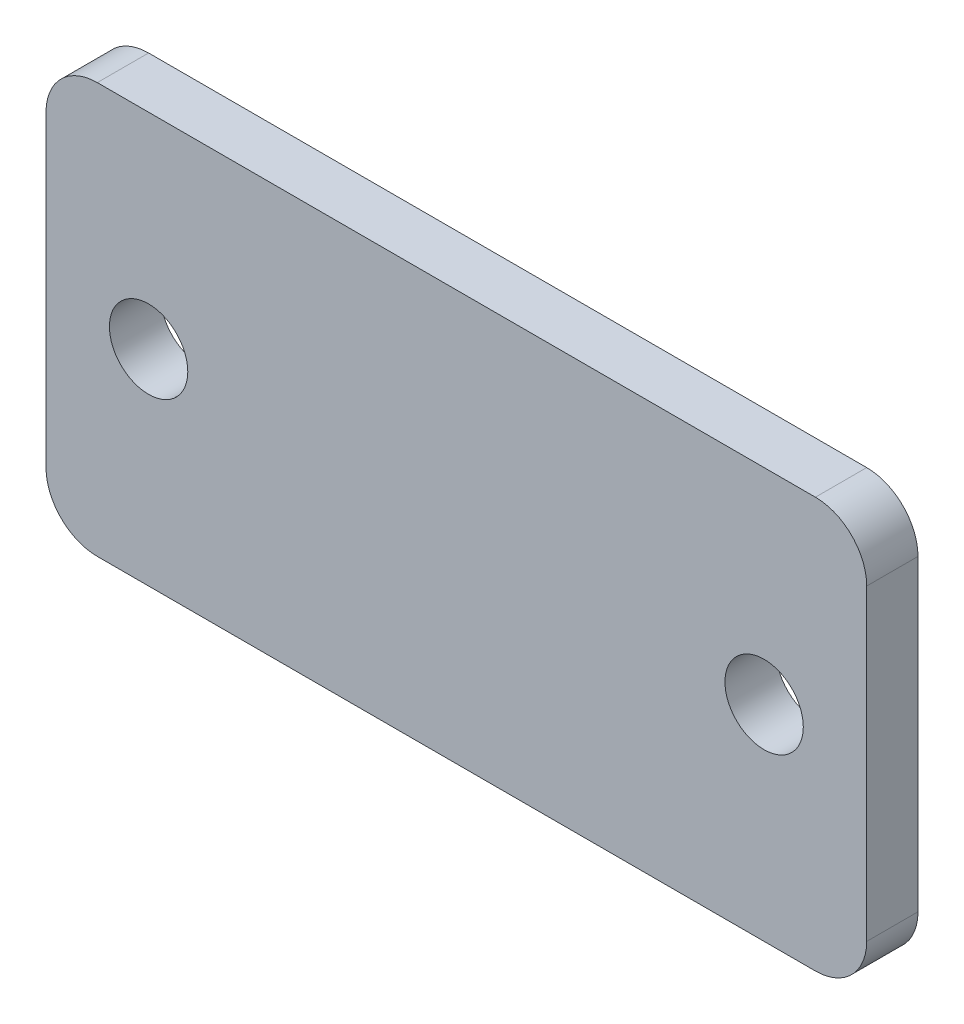
ISO-10303-21;
HEADER;
FILE_DESCRIPTION(('STEP AP214'),'2;1');
FILE_NAME('part.step','',(''),(''),'','','');
FILE_SCHEMA(('AUTOMOTIVE_DESIGN { 1 0 10303 214 1 1 1 1 }'));
ENDSEC;
DATA;
#1=APPLICATION_CONTEXT('core data for automotive mechanical design processes');
#2=APPLICATION_PROTOCOL_DEFINITION('international standard','automotive_design',2000,#1);
#3=PRODUCT_CONTEXT('',#1,'mechanical');
#4=PRODUCT('Part','Part','',(#3));
#5=PRODUCT_RELATED_PRODUCT_CATEGORY('part','',(#4));
#6=PRODUCT_DEFINITION_FORMATION('','',#4);
#7=PRODUCT_DEFINITION_CONTEXT('part definition',#1,'design');
#8=PRODUCT_DEFINITION('design','',#6,#7);
#9=PRODUCT_DEFINITION_SHAPE('','',#8);
#10=(LENGTH_UNIT() NAMED_UNIT(*) SI_UNIT(.MILLI.,.METRE.));
#11=(NAMED_UNIT(*) PLANE_ANGLE_UNIT() SI_UNIT($,.RADIAN.));
#12=(NAMED_UNIT(*) SI_UNIT($,.STERADIAN.) SOLID_ANGLE_UNIT());
#13=UNCERTAINTY_MEASURE_WITH_UNIT(LENGTH_MEASURE(1.E-05),#10,'distance_accuracy_value','');
#14=(GEOMETRIC_REPRESENTATION_CONTEXT(3) GLOBAL_UNCERTAINTY_ASSIGNED_CONTEXT((#13)) GLOBAL_UNIT_ASSIGNED_CONTEXT((#10,
#11,#12)) REPRESENTATION_CONTEXT('',''));
#15=CARTESIAN_POINT('',(0.,0.,0.));
#16=DIRECTION('',(0.,0.,1.));
#17=DIRECTION('',(1.,0.,0.));
#18=AXIS2_PLACEMENT_3D('',#15,#16,#17);
#19=CARTESIAN_POINT('',(50.8,12.7,-3.175));
#20=DIRECTION('',(1.,0.,0.));
#21=DIRECTION('',(0.,1.,0.));
#22=AXIS2_PLACEMENT_3D('',#19,#20,#21);
#23=PLANE('',#22);
#24=DIRECTION('',(0.,1.,0.));
#25=VECTOR('',#24,1.);
#26=CARTESIAN_POINT('',(50.8,12.7,0.));
#27=LINE('',#26,#25);
#28=CARTESIAN_POINT('',(50.8,3.175,0.));
#29=VERTEX_POINT('',#28);
#30=CARTESIAN_POINT('',(50.8,22.225,0.));
#31=VERTEX_POINT('',#30);
#32=EDGE_CURVE('E105',#29,#31,#27,.T.);
#33=ORIENTED_EDGE('',*,*,#32,.F.);
#34=DIRECTION('',(0.,0.,1.));
#35=VECTOR('',#34,1.);
#36=CARTESIAN_POINT('',(50.8,3.175,-3.175));
#37=LINE('',#36,#35);
#38=CARTESIAN_POINT('',(50.8,3.175,-3.175));
#39=VERTEX_POINT('',#38);
#40=EDGE_CURVE('E127',#29,#39,#37,.F.);
#41=ORIENTED_EDGE('',*,*,#40,.T.);
#42=DIRECTION('',(0.,1.,0.));
#43=VECTOR('',#42,1.);
#44=CARTESIAN_POINT('',(50.8,12.7,-3.175));
#45=LINE('',#44,#43);
#46=CARTESIAN_POINT('',(50.8,22.225,-3.175));
#47=VERTEX_POINT('',#46);
#48=EDGE_CURVE('E147',#39,#47,#45,.T.);
#49=ORIENTED_EDGE('',*,*,#48,.T.);
#50=DIRECTION('',(0.,0.,1.));
#51=VECTOR('',#50,1.);
#52=CARTESIAN_POINT('',(50.8,22.225,0.));
#53=LINE('',#52,#51);
#54=EDGE_CURVE('E124',#47,#31,#53,.T.);
#55=ORIENTED_EDGE('',*,*,#54,.T.);
#56=EDGE_LOOP('',(#33,#41,#49,#55));
#57=FACE_BOUND('',#56,.T.);
#58=ADVANCED_FACE('F17',(#57),#23,.T.);
#59=CARTESIAN_POINT('',(6.35,0.,-3.175));
#60=DIRECTION('',(0.,-1.,0.));
#61=DIRECTION('',(0.,0.,-1.));
#62=AXIS2_PLACEMENT_3D('',#59,#60,#61);
#63=PLANE('',#62);
#64=DIRECTION('',(1.,0.,0.));
#65=VECTOR('',#64,1.);
#66=CARTESIAN_POINT('',(6.35,0.,-3.175));
#67=LINE('',#66,#65);
#68=CARTESIAN_POINT('',(3.175,0.,-3.175));
#69=VERTEX_POINT('',#68);
#70=CARTESIAN_POINT('',(47.625,0.,-3.175));
#71=VERTEX_POINT('',#70);
#72=EDGE_CURVE('E144',#69,#71,#67,.T.);
#73=ORIENTED_EDGE('',*,*,#72,.T.);
#74=DIRECTION('',(0.,0.,1.));
#75=VECTOR('',#74,1.);
#76=CARTESIAN_POINT('',(47.625,0.,-3.175));
#77=LINE('',#76,#75);
#78=CARTESIAN_POINT('',(47.625,0.,0.));
#79=VERTEX_POINT('',#78);
#80=EDGE_CURVE('E104',#71,#79,#77,.T.);
#81=ORIENTED_EDGE('',*,*,#80,.T.);
#82=DIRECTION('',(1.,0.,0.));
#83=VECTOR('',#82,1.);
#84=CARTESIAN_POINT('',(6.35,0.,0.));
#85=LINE('',#84,#83);
#86=CARTESIAN_POINT('',(3.175,0.,0.));
#87=VERTEX_POINT('',#86);
#88=EDGE_CURVE('E87',#87,#79,#85,.T.);
#89=ORIENTED_EDGE('',*,*,#88,.F.);
#90=DIRECTION('',(0.,0.,1.));
#91=VECTOR('',#90,1.);
#92=CARTESIAN_POINT('',(3.175,0.,-3.175));
#93=LINE('',#92,#91);
#94=EDGE_CURVE('E101',#87,#69,#93,.F.);
#95=ORIENTED_EDGE('',*,*,#94,.T.);
#96=EDGE_LOOP('',(#73,#81,#89,#95));
#97=FACE_BOUND('',#96,.T.);
#98=ADVANCED_FACE('F100',(#97),#63,.T.);
#99=CARTESIAN_POINT('',(0.,12.7,-3.175));
#100=DIRECTION('',(1.,0.,0.));
#101=DIRECTION('',(0.,0.,-1.));
#102=AXIS2_PLACEMENT_3D('',#99,#100,#101);
#103=PLANE('',#102);
#104=DIRECTION('',(0.,1.,0.));
#105=VECTOR('',#104,1.);
#106=CARTESIAN_POINT('',(0.,12.7,-3.175));
#107=LINE('',#106,#105);
#108=CARTESIAN_POINT('',(0.,3.175,-3.175));
#109=VERTEX_POINT('',#108);
#110=CARTESIAN_POINT('',(0.,22.225,-3.175));
#111=VERTEX_POINT('',#110);
#112=EDGE_CURVE('E142',#109,#111,#107,.T.);
#113=ORIENTED_EDGE('',*,*,#112,.F.);
#114=DIRECTION('',(0.,0.,1.));
#115=VECTOR('',#114,1.);
#116=CARTESIAN_POINT('',(0.,3.175,0.));
#117=LINE('',#116,#115);
#118=CARTESIAN_POINT('',(0.,3.175,0.));
#119=VERTEX_POINT('',#118);
#120=EDGE_CURVE('E137',#109,#119,#117,.T.);
#121=ORIENTED_EDGE('',*,*,#120,.T.);
#122=DIRECTION('',(0.,1.,0.));
#123=VECTOR('',#122,1.);
#124=CARTESIAN_POINT('',(0.,12.7,0.));
#125=LINE('',#124,#123);
#126=CARTESIAN_POINT('',(0.,22.225,0.));
#127=VERTEX_POINT('',#126);
#128=EDGE_CURVE('E89',#119,#127,#125,.T.);
#129=ORIENTED_EDGE('',*,*,#128,.T.);
#130=DIRECTION('',(0.,0.,1.));
#131=VECTOR('',#130,1.);
#132=CARTESIAN_POINT('',(0.,22.225,-3.175));
#133=LINE('',#132,#131);
#134=EDGE_CURVE('E135',#127,#111,#133,.F.);
#135=ORIENTED_EDGE('',*,*,#134,.T.);
#136=EDGE_LOOP('',(#113,#121,#129,#135));
#137=FACE_BOUND('',#136,.T.);
#138=ADVANCED_FACE('F140',(#137),#103,.F.);
#139=CARTESIAN_POINT('',(44.45,12.7,-3.175));
#140=DIRECTION('',(0.,0.,1.));
#141=DIRECTION('',(1.,0.,0.));
#142=AXIS2_PLACEMENT_3D('',#139,#140,#141);
#143=CYLINDRICAL_SURFACE('',#142,2.4257);
#144=CARTESIAN_POINT('',(44.45,12.7,-3.175));
#145=DIRECTION('',(0.,0.,1.));
#146=DIRECTION('',(1.,0.,0.));
#147=AXIS2_PLACEMENT_3D('',#144,#145,#146);
#148=CIRCLE('',#147,2.4257);
#149=CARTESIAN_POINT('',(46.8757,12.7,-3.175));
#150=VERTEX_POINT('',#149);
#151=EDGE_CURVE('E115',#150,#150,#148,.T.);
#152=ORIENTED_EDGE('',*,*,#151,.F.);
#153=EDGE_LOOP('',(#152));
#154=FACE_BOUND('',#153,.T.);
#155=CARTESIAN_POINT('',(44.45,12.7,0.));
#156=DIRECTION('',(0.,0.,1.));
#157=DIRECTION('',(1.,0.,0.));
#158=AXIS2_PLACEMENT_3D('',#155,#156,#157);
#159=CIRCLE('',#158,2.4257);
#160=CARTESIAN_POINT('',(46.8757,12.7,0.));
#161=VERTEX_POINT('',#160);
#162=EDGE_CURVE('E157',#161,#161,#159,.T.);
#163=ORIENTED_EDGE('',*,*,#162,.T.);
#164=EDGE_LOOP('',(#163));
#165=FACE_BOUND('',#164,.T.);
#166=ADVANCED_FACE('F214',(#154,#165),#143,.F.);
#167=CARTESIAN_POINT('',(6.35,25.4,-3.175));
#168=DIRECTION('',(0.,-1.,0.));
#169=DIRECTION('',(0.,0.,-1.));
#170=AXIS2_PLACEMENT_3D('',#167,#168,#169);
#171=PLANE('',#170);
#172=DIRECTION('',(1.,0.,0.));
#173=VECTOR('',#172,1.);
#174=CARTESIAN_POINT('',(6.35,25.4,-3.175));
#175=LINE('',#174,#173);
#176=CARTESIAN_POINT('',(3.175,25.4,-3.175));
#177=VERTEX_POINT('',#176);
#178=CARTESIAN_POINT('',(47.625,25.4,-3.175));
#179=VERTEX_POINT('',#178);
#180=EDGE_CURVE('E143',#177,#179,#175,.T.);
#181=ORIENTED_EDGE('',*,*,#180,.F.);
#182=DIRECTION('',(0.,0.,1.));
#183=VECTOR('',#182,1.);
#184=CARTESIAN_POINT('',(3.175,25.4,-3.175));
#185=LINE('',#184,#183);
#186=CARTESIAN_POINT('',(3.175,25.4,0.));
#187=VERTEX_POINT('',#186);
#188=EDGE_CURVE('E11',#177,#187,#185,.T.);
#189=ORIENTED_EDGE('',*,*,#188,.T.);
#190=DIRECTION('',(1.,0.,0.));
#191=VECTOR('',#190,1.);
#192=CARTESIAN_POINT('',(6.35,25.4,0.));
#193=LINE('',#192,#191);
#194=CARTESIAN_POINT('',(47.625,25.4,0.));
#195=VERTEX_POINT('',#194);
#196=EDGE_CURVE('E156',#187,#195,#193,.T.);
#197=ORIENTED_EDGE('',*,*,#196,.T.);
#198=DIRECTION('',(0.,0.,1.));
#199=VECTOR('',#198,1.);
#200=CARTESIAN_POINT('',(47.625,25.4,-3.175));
#201=LINE('',#200,#199);
#202=EDGE_CURVE('E25',#195,#179,#201,.F.);
#203=ORIENTED_EDGE('',*,*,#202,.T.);
#204=EDGE_LOOP('',(#181,#189,#197,#203));
#205=FACE_BOUND('',#204,.T.);
#206=ADVANCED_FACE('F174',(#205),#171,.F.);
#207=CARTESIAN_POINT('',(6.35,12.7,-3.175));
#208=DIRECTION('',(0.,0.,1.));
#209=DIRECTION('',(1.,0.,0.));
#210=AXIS2_PLACEMENT_3D('',#207,#208,#209);
#211=CYLINDRICAL_SURFACE('',#210,2.4257);
#212=CARTESIAN_POINT('',(6.35,12.7,-3.175));
#213=DIRECTION('',(0.,0.,1.));
#214=DIRECTION('',(1.,0.,0.));
#215=AXIS2_PLACEMENT_3D('',#212,#213,#214);
#216=CIRCLE('',#215,2.4257);
#217=CARTESIAN_POINT('',(8.7757,12.7,-3.175));
#218=VERTEX_POINT('',#217);
#219=EDGE_CURVE('E110',#218,#218,#216,.T.);
#220=ORIENTED_EDGE('',*,*,#219,.F.);
#221=EDGE_LOOP('',(#220));
#222=FACE_BOUND('',#221,.T.);
#223=CARTESIAN_POINT('',(6.35,12.7,0.));
#224=DIRECTION('',(0.,0.,1.));
#225=DIRECTION('',(1.,0.,0.));
#226=AXIS2_PLACEMENT_3D('',#223,#224,#225);
#227=CIRCLE('',#226,2.4257);
#228=CARTESIAN_POINT('',(8.7757,12.7,0.));
#229=VERTEX_POINT('',#228);
#230=EDGE_CURVE('E118',#229,#229,#227,.T.);
#231=ORIENTED_EDGE('',*,*,#230,.T.);
#232=EDGE_LOOP('',(#231));
#233=FACE_BOUND('',#232,.T.);
#234=ADVANCED_FACE('F203',(#222,#233),#211,.F.);
#235=CARTESIAN_POINT('',(25.4,12.7,-3.175));
#236=DIRECTION('',(0.,0.,1.));
#237=DIRECTION('',(1.,0.,0.));
#238=AXIS2_PLACEMENT_3D('',#235,#236,#237);
#239=PLANE('',#238);
#240=ORIENTED_EDGE('',*,*,#48,.F.);
#241=CARTESIAN_POINT('',(47.625,3.175,-3.175));
#242=DIRECTION('',(0.,0.,1.));
#243=DIRECTION('',(1.,0.,0.));
#244=AXIS2_PLACEMENT_3D('',#241,#242,#243);
#245=CIRCLE('',#244,3.175);
#246=EDGE_CURVE('E133',#39,#71,#245,.F.);
#247=ORIENTED_EDGE('',*,*,#246,.T.);
#248=ORIENTED_EDGE('',*,*,#72,.F.);
#249=CARTESIAN_POINT('',(3.175,3.175,-3.175));
#250=DIRECTION('',(0.,0.,1.));
#251=DIRECTION('',(1.,0.,0.));
#252=AXIS2_PLACEMENT_3D('',#249,#250,#251);
#253=CIRCLE('',#252,3.175);
#254=EDGE_CURVE('E109',#69,#109,#253,.F.);
#255=ORIENTED_EDGE('',*,*,#254,.T.);
#256=ORIENTED_EDGE('',*,*,#112,.T.);
#257=CARTESIAN_POINT('',(3.175,22.225,-3.175));
#258=DIRECTION('',(0.,0.,1.));
#259=DIRECTION('',(1.,0.,0.));
#260=AXIS2_PLACEMENT_3D('',#257,#258,#259);
#261=CIRCLE('',#260,3.175);
#262=EDGE_CURVE('E38',#111,#177,#261,.F.);
#263=ORIENTED_EDGE('',*,*,#262,.T.);
#264=ORIENTED_EDGE('',*,*,#180,.T.);
#265=CARTESIAN_POINT('',(47.625,22.225,-3.175));
#266=DIRECTION('',(0.,0.,1.));
#267=DIRECTION('',(1.,0.,0.));
#268=AXIS2_PLACEMENT_3D('',#265,#266,#267);
#269=CIRCLE('',#268,3.175);
#270=EDGE_CURVE('E129',#179,#47,#269,.F.);
#271=ORIENTED_EDGE('',*,*,#270,.T.);
#272=EDGE_LOOP('',(#240,#247,#248,#255,#256,#263,#264,#271));
#273=FACE_BOUND('',#272,.T.);
#274=ORIENTED_EDGE('',*,*,#151,.T.);
#275=EDGE_LOOP('',(#274));
#276=FACE_BOUND('',#275,.T.);
#277=ORIENTED_EDGE('',*,*,#219,.T.);
#278=EDGE_LOOP('',(#277));
#279=FACE_BOUND('',#278,.T.);
#280=ADVANCED_FACE('F199',(#273,#276,#279),#239,.F.);
#281=CARTESIAN_POINT('',(25.4,12.7,0.));
#282=DIRECTION('',(0.,0.,1.));
#283=DIRECTION('',(1.,0.,0.));
#284=AXIS2_PLACEMENT_3D('',#281,#282,#283);
#285=PLANE('',#284);
#286=ORIENTED_EDGE('',*,*,#88,.T.);
#287=CARTESIAN_POINT('',(47.625,3.175,0.));
#288=DIRECTION('',(0.,0.,1.));
#289=DIRECTION('',(1.,0.,0.));
#290=AXIS2_PLACEMENT_3D('',#287,#288,#289);
#291=CIRCLE('',#290,3.175);
#292=EDGE_CURVE('E94',#79,#29,#291,.T.);
#293=ORIENTED_EDGE('',*,*,#292,.T.);
#294=ORIENTED_EDGE('',*,*,#32,.T.);
#295=CARTESIAN_POINT('',(47.625,22.225,0.));
#296=DIRECTION('',(0.,0.,1.));
#297=DIRECTION('',(1.,0.,0.));
#298=AXIS2_PLACEMENT_3D('',#295,#296,#297);
#299=CIRCLE('',#298,3.175);
#300=EDGE_CURVE('E112',#31,#195,#299,.T.);
#301=ORIENTED_EDGE('',*,*,#300,.T.);
#302=ORIENTED_EDGE('',*,*,#196,.F.);
#303=CARTESIAN_POINT('',(3.175,22.225,0.));
#304=DIRECTION('',(0.,0.,1.));
#305=DIRECTION('',(1.,0.,0.));
#306=AXIS2_PLACEMENT_3D('',#303,#304,#305);
#307=CIRCLE('',#306,3.175);
#308=EDGE_CURVE('E95',#187,#127,#307,.T.);
#309=ORIENTED_EDGE('',*,*,#308,.T.);
#310=ORIENTED_EDGE('',*,*,#128,.F.);
#311=CARTESIAN_POINT('',(3.175,3.175,0.));
#312=DIRECTION('',(0.,0.,1.));
#313=DIRECTION('',(1.,0.,0.));
#314=AXIS2_PLACEMENT_3D('',#311,#312,#313);
#315=CIRCLE('',#314,3.175);
#316=EDGE_CURVE('E83',#119,#87,#315,.T.);
#317=ORIENTED_EDGE('',*,*,#316,.T.);
#318=EDGE_LOOP('',(#286,#293,#294,#301,#302,#309,#310,#317));
#319=FACE_BOUND('',#318,.T.);
#320=ORIENTED_EDGE('',*,*,#162,.F.);
#321=EDGE_LOOP('',(#320));
#322=FACE_BOUND('',#321,.T.);
#323=ORIENTED_EDGE('',*,*,#230,.F.);
#324=EDGE_LOOP('',(#323));
#325=FACE_BOUND('',#324,.T.);
#326=ADVANCED_FACE('F85',(#319,#322,#325),#285,.T.);
#327=CARTESIAN_POINT('',(47.625,3.175,-3.175));
#328=DIRECTION('',(0.,0.,1.));
#329=DIRECTION('',(1.,0.,0.));
#330=AXIS2_PLACEMENT_3D('',#327,#328,#329);
#331=CYLINDRICAL_SURFACE('',#330,3.175);
#332=ORIENTED_EDGE('',*,*,#246,.F.);
#333=ORIENTED_EDGE('',*,*,#40,.F.);
#334=ORIENTED_EDGE('',*,*,#292,.F.);
#335=ORIENTED_EDGE('',*,*,#80,.F.);
#336=EDGE_LOOP('',(#332,#333,#334,#335));
#337=FACE_BOUND('',#336,.T.);
#338=ADVANCED_FACE('F184',(#337),#331,.T.);
#339=CARTESIAN_POINT('',(3.175,3.175,-3.175));
#340=DIRECTION('',(0.,0.,-1.));
#341=DIRECTION('',(-1.,0.,0.));
#342=AXIS2_PLACEMENT_3D('',#339,#340,#341);
#343=CYLINDRICAL_SURFACE('',#342,3.175);
#344=ORIENTED_EDGE('',*,*,#254,.F.);
#345=ORIENTED_EDGE('',*,*,#94,.F.);
#346=ORIENTED_EDGE('',*,*,#316,.F.);
#347=ORIENTED_EDGE('',*,*,#120,.F.);
#348=EDGE_LOOP('',(#344,#345,#346,#347));
#349=FACE_BOUND('',#348,.T.);
#350=ADVANCED_FACE('F108',(#349),#343,.T.);
#351=CARTESIAN_POINT('',(3.175,22.225,-3.175));
#352=DIRECTION('',(0.,0.,1.));
#353=DIRECTION('',(1.,0.,0.));
#354=AXIS2_PLACEMENT_3D('',#351,#352,#353);
#355=CYLINDRICAL_SURFACE('',#354,3.175);
#356=ORIENTED_EDGE('',*,*,#262,.F.);
#357=ORIENTED_EDGE('',*,*,#134,.F.);
#358=ORIENTED_EDGE('',*,*,#308,.F.);
#359=ORIENTED_EDGE('',*,*,#188,.F.);
#360=EDGE_LOOP('',(#356,#357,#358,#359));
#361=FACE_BOUND('',#360,.T.);
#362=ADVANCED_FACE('F177',(#361),#355,.T.);
#363=CARTESIAN_POINT('',(47.625,22.225,-3.175));
#364=DIRECTION('',(0.,0.,-1.));
#365=DIRECTION('',(-1.,0.,0.));
#366=AXIS2_PLACEMENT_3D('',#363,#364,#365);
#367=CYLINDRICAL_SURFACE('',#366,3.175);
#368=ORIENTED_EDGE('',*,*,#270,.F.);
#369=ORIENTED_EDGE('',*,*,#202,.F.);
#370=ORIENTED_EDGE('',*,*,#300,.F.);
#371=ORIENTED_EDGE('',*,*,#54,.F.);
#372=EDGE_LOOP('',(#368,#369,#370,#371));
#373=FACE_BOUND('',#372,.T.);
#374=ADVANCED_FACE('F19',(#373),#367,.T.);
#375=CLOSED_SHELL('',(#58,#98,#138,#166,#206,#234,#280,#326,#338,#350,#362,#374));
#376=MANIFOLD_SOLID_BREP('B1',#375);
#377=ADVANCED_BREP_SHAPE_REPRESENTATION('',(#18,#376),#14);
#378=SHAPE_DEFINITION_REPRESENTATION(#9,#377);
ENDSEC;
END-ISO-10303-21;
